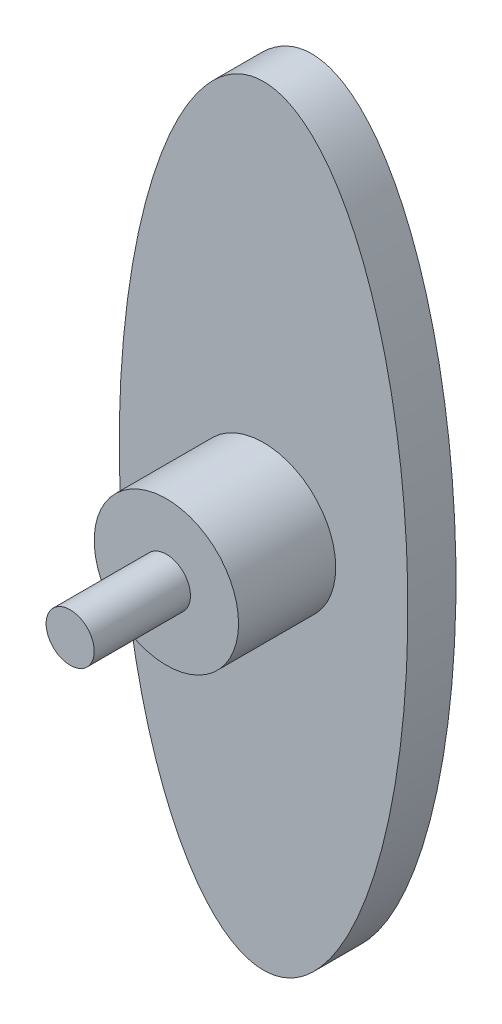
ISO-10303-21;
HEADER;
FILE_DESCRIPTION(('STEP AP214'),'2;1');
FILE_NAME('part.step','',(''),(''),'','','');
FILE_SCHEMA(('AUTOMOTIVE_DESIGN { 1 0 10303 214 1 1 1 1 }'));
ENDSEC;
DATA;
#1=APPLICATION_CONTEXT('core data for automotive mechanical design processes');
#2=APPLICATION_PROTOCOL_DEFINITION('international standard','automotive_design',2000,#1);
#3=PRODUCT_CONTEXT('',#1,'mechanical');
#4=PRODUCT('Part','Part','',(#3));
#5=PRODUCT_RELATED_PRODUCT_CATEGORY('part','',(#4));
#6=PRODUCT_DEFINITION_FORMATION('','',#4);
#7=PRODUCT_DEFINITION_CONTEXT('part definition',#1,'design');
#8=PRODUCT_DEFINITION('design','',#6,#7);
#9=PRODUCT_DEFINITION_SHAPE('','',#8);
#10=(LENGTH_UNIT() NAMED_UNIT(*) SI_UNIT(.MILLI.,.METRE.));
#11=(NAMED_UNIT(*) PLANE_ANGLE_UNIT() SI_UNIT($,.RADIAN.));
#12=(NAMED_UNIT(*) SI_UNIT($,.STERADIAN.) SOLID_ANGLE_UNIT());
#13=UNCERTAINTY_MEASURE_WITH_UNIT(LENGTH_MEASURE(1.E-05),#10,'distance_accuracy_value','');
#14=(GEOMETRIC_REPRESENTATION_CONTEXT(3) GLOBAL_UNCERTAINTY_ASSIGNED_CONTEXT((#13)) GLOBAL_UNIT_ASSIGNED_CONTEXT((#10,
#11,#12)) REPRESENTATION_CONTEXT('',''));
#15=CARTESIAN_POINT('',(0.,0.,0.));
#16=DIRECTION('',(0.,0.,1.));
#17=DIRECTION('',(1.,0.,0.));
#18=AXIS2_PLACEMENT_3D('',#15,#16,#17);
#19=CARTESIAN_POINT('',(0.,0.,3.175));
#20=DIRECTION('',(0.,0.,1.));
#21=DIRECTION('',(0.,1.,0.));
#22=AXIS2_PLACEMENT_3D('',#19,#20,#21);
#23=ELLIPSE('',#22,50.8,19.05);
#24=DIRECTION('',(0.,0.,-1.));
#25=VECTOR('',#24,1.);
#26=SURFACE_OF_LINEAR_EXTRUSION('',#23,#25);
#27=CARTESIAN_POINT('',(0.,50.8,3.175));
#28=VERTEX_POINT('',#27);
#29=EDGE_CURVE('E10',#28,#28,#23,.T.);
#30=ORIENTED_EDGE('',*,*,#29,.F.);
#31=EDGE_LOOP('',(#30));
#32=FACE_BOUND('',#31,.T.);
#33=CARTESIAN_POINT('',(0.,0.,-3.175));
#34=DIRECTION('',(0.,0.,1.));
#35=DIRECTION('',(0.,1.,0.));
#36=AXIS2_PLACEMENT_3D('',#33,#34,#35);
#37=ELLIPSE('',#36,50.8,19.05);
#38=CARTESIAN_POINT('',(0.,50.8,-3.175));
#39=VERTEX_POINT('',#38);
#40=EDGE_CURVE('E39',#39,#39,#37,.T.);
#41=ORIENTED_EDGE('',*,*,#40,.T.);
#42=EDGE_LOOP('',(#41));
#43=FACE_BOUND('',#42,.T.);
#44=ADVANCED_FACE('F31',(#32,#43),#26,.F.);
#45=CARTESIAN_POINT('',(0.,0.,3.175));
#46=DIRECTION('',(0.,0.,1.));
#47=DIRECTION('',(1.,0.,0.));
#48=AXIS2_PLACEMENT_3D('',#45,#46,#47);
#49=PLANE('',#48);
#50=CARTESIAN_POINT('',(0.,0.,3.175));
#51=DIRECTION('',(0.,0.,1.));
#52=DIRECTION('',(1.,0.,0.));
#53=AXIS2_PLACEMENT_3D('',#50,#51,#52);
#54=CIRCLE('',#53,9.525);
#55=CARTESIAN_POINT('',(9.525,0.,3.175));
#56=VERTEX_POINT('',#55);
#57=EDGE_CURVE('E43',#56,#56,#54,.F.);
#58=ORIENTED_EDGE('',*,*,#57,.T.);
#59=EDGE_LOOP('',(#58));
#60=FACE_BOUND('',#59,.T.);
#61=ORIENTED_EDGE('',*,*,#29,.T.);
#62=EDGE_LOOP('',(#61));
#63=FACE_BOUND('',#62,.T.);
#64=ADVANCED_FACE('F77',(#60,#63),#49,.T.);
#65=CARTESIAN_POINT('',(0.,0.,-3.175));
#66=DIRECTION('',(0.,0.,1.));
#67=DIRECTION('',(1.,0.,0.));
#68=AXIS2_PLACEMENT_3D('',#65,#66,#67);
#69=PLANE('',#68);
#70=ORIENTED_EDGE('',*,*,#40,.F.);
#71=EDGE_LOOP('',(#70));
#72=FACE_BOUND('',#71,.T.);
#73=ADVANCED_FACE('F82',(#72),#69,.F.);
#74=CARTESIAN_POINT('',(0.,0.,16.002));
#75=DIRECTION('',(0.,0.,-1.));
#76=DIRECTION('',(-1.,0.,0.));
#77=AXIS2_PLACEMENT_3D('',#74,#75,#76);
#78=CYLINDRICAL_SURFACE('',#77,9.525);
#79=ORIENTED_EDGE('',*,*,#57,.F.);
#80=EDGE_LOOP('',(#79));
#81=FACE_BOUND('',#80,.T.);
#82=CARTESIAN_POINT('',(0.,0.,16.002));
#83=DIRECTION('',(0.,0.,1.));
#84=DIRECTION('',(1.,0.,0.));
#85=AXIS2_PLACEMENT_3D('',#82,#83,#84);
#86=CIRCLE('',#85,9.525);
#87=CARTESIAN_POINT('',(9.525,0.,16.002));
#88=VERTEX_POINT('',#87);
#89=EDGE_CURVE('E47',#88,#88,#86,.T.);
#90=ORIENTED_EDGE('',*,*,#89,.F.);
#91=EDGE_LOOP('',(#90));
#92=FACE_BOUND('',#91,.T.);
#93=ADVANCED_FACE('F74',(#81,#92),#78,.T.);
#94=CARTESIAN_POINT('',(0.,0.,16.002));
#95=DIRECTION('',(0.,0.,1.));
#96=DIRECTION('',(1.,0.,0.));
#97=AXIS2_PLACEMENT_3D('',#94,#95,#96);
#98=PLANE('',#97);
#99=CARTESIAN_POINT('',(0.,0.,16.002));
#100=DIRECTION('',(0.,0.,1.));
#101=DIRECTION('',(1.,0.,0.));
#102=AXIS2_PLACEMENT_3D('',#99,#100,#101);
#103=CIRCLE('',#102,3.175);
#104=CARTESIAN_POINT('',(3.175,0.,16.002));
#105=VERTEX_POINT('',#104);
#106=EDGE_CURVE('E35',#105,#105,#103,.F.);
#107=ORIENTED_EDGE('',*,*,#106,.T.);
#108=EDGE_LOOP('',(#107));
#109=FACE_BOUND('',#108,.T.);
#110=ORIENTED_EDGE('',*,*,#89,.T.);
#111=EDGE_LOOP('',(#110));
#112=FACE_BOUND('',#111,.T.);
#113=ADVANCED_FACE('F66',(#109,#112),#98,.T.);
#114=CARTESIAN_POINT('',(0.,0.,28.702));
#115=DIRECTION('',(0.,0.,-1.));
#116=DIRECTION('',(-1.,0.,0.));
#117=AXIS2_PLACEMENT_3D('',#114,#115,#116);
#118=CYLINDRICAL_SURFACE('',#117,3.175);
#119=ORIENTED_EDGE('',*,*,#106,.F.);
#120=EDGE_LOOP('',(#119));
#121=FACE_BOUND('',#120,.T.);
#122=CARTESIAN_POINT('',(0.,0.,28.702));
#123=DIRECTION('',(0.,0.,1.));
#124=DIRECTION('',(1.,0.,0.));
#125=AXIS2_PLACEMENT_3D('',#122,#123,#124);
#126=CIRCLE('',#125,3.175);
#127=CARTESIAN_POINT('',(3.175,0.,28.702));
#128=VERTEX_POINT('',#127);
#129=EDGE_CURVE('E56',#128,#128,#126,.T.);
#130=ORIENTED_EDGE('',*,*,#129,.F.);
#131=EDGE_LOOP('',(#130));
#132=FACE_BOUND('',#131,.T.);
#133=ADVANCED_FACE('F64',(#121,#132),#118,.T.);
#134=CARTESIAN_POINT('',(0.,0.,28.702));
#135=DIRECTION('',(0.,0.,1.));
#136=DIRECTION('',(1.,0.,0.));
#137=AXIS2_PLACEMENT_3D('',#134,#135,#136);
#138=PLANE('',#137);
#139=ORIENTED_EDGE('',*,*,#129,.T.);
#140=EDGE_LOOP('',(#139));
#141=FACE_BOUND('',#140,.T.);
#142=ADVANCED_FACE('F62',(#141),#138,.T.);
#143=CLOSED_SHELL('',(#44,#64,#73,#93,#113,#133,#142));
#144=MANIFOLD_SOLID_BREP('B2',#143);
#145=ADVANCED_BREP_SHAPE_REPRESENTATION('',(#18,#144),#14);
#146=SHAPE_DEFINITION_REPRESENTATION(#9,#145);
ENDSEC;
END-ISO-10303-21;
